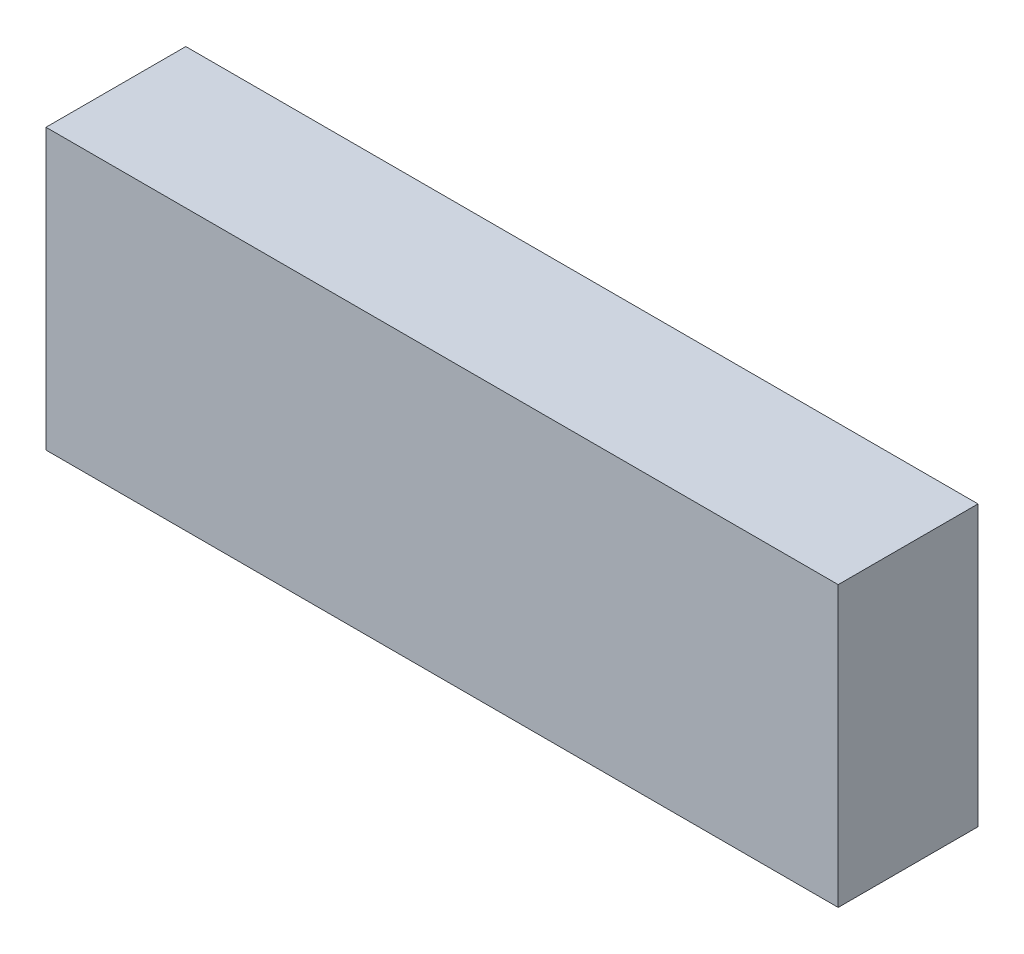
ISO-10303-21;
HEADER;
FILE_DESCRIPTION(('STEP AP214'),'2;1');
FILE_NAME('part.step','',(''),(''),'','','');
FILE_SCHEMA(('AUTOMOTIVE_DESIGN { 1 0 10303 214 1 1 1 1 }'));
ENDSEC;
DATA;
#1=APPLICATION_CONTEXT('core data for automotive mechanical design processes');
#2=APPLICATION_PROTOCOL_DEFINITION('international standard','automotive_design',2000,#1);
#3=PRODUCT_CONTEXT('',#1,'mechanical');
#4=PRODUCT('Part','Part','',(#3));
#5=PRODUCT_RELATED_PRODUCT_CATEGORY('part','',(#4));
#6=PRODUCT_DEFINITION_FORMATION('','',#4);
#7=PRODUCT_DEFINITION_CONTEXT('part definition',#1,'design');
#8=PRODUCT_DEFINITION('design','',#6,#7);
#9=PRODUCT_DEFINITION_SHAPE('','',#8);
#10=(LENGTH_UNIT() NAMED_UNIT(*) SI_UNIT(.MILLI.,.METRE.));
#11=(NAMED_UNIT(*) PLANE_ANGLE_UNIT() SI_UNIT($,.RADIAN.));
#12=(NAMED_UNIT(*) SI_UNIT($,.STERADIAN.) SOLID_ANGLE_UNIT());
#13=UNCERTAINTY_MEASURE_WITH_UNIT(LENGTH_MEASURE(1.E-05),#10,'distance_accuracy_value','');
#14=(GEOMETRIC_REPRESENTATION_CONTEXT(3) GLOBAL_UNCERTAINTY_ASSIGNED_CONTEXT((#13)) GLOBAL_UNIT_ASSIGNED_CONTEXT((#10,
#11,#12)) REPRESENTATION_CONTEXT('',''));
#15=CARTESIAN_POINT('',(0.,0.,0.));
#16=DIRECTION('',(0.,0.,1.));
#17=DIRECTION('',(1.,0.,0.));
#18=AXIS2_PLACEMENT_3D('',#15,#16,#17);
#19=CARTESIAN_POINT('',(52.9979544735839,-83.0177683615576,19.05));
#20=DIRECTION('',(1.,0.,0.));
#21=DIRECTION('',(0.,0.,-1.));
#22=AXIS2_PLACEMENT_3D('',#19,#20,#21);
#23=PLANE('',#22);
#24=DIRECTION('',(0.,-1.,0.));
#25=VECTOR('',#24,1.);
#26=CARTESIAN_POINT('',(52.9979544735839,-83.0177683615576,0.));
#27=LINE('',#26,#25);
#28=CARTESIAN_POINT('',(52.9979544735839,25.2152812507937,0.));
#29=VERTEX_POINT('',#28);
#30=CARTESIAN_POINT('',(52.9979544735839,-12.8847187492063,0.));
#31=VERTEX_POINT('',#30);
#32=EDGE_CURVE('E100',#29,#31,#27,.T.);
#33=ORIENTED_EDGE('',*,*,#32,.F.);
#34=DIRECTION('',(0.,0.,-1.));
#35=VECTOR('',#34,1.);
#36=CARTESIAN_POINT('',(52.9979544735839,25.2152812507937,19.05));
#37=LINE('',#36,#35);
#38=CARTESIAN_POINT('',(52.9979544735839,25.2152812507937,19.05));
#39=VERTEX_POINT('',#38);
#40=EDGE_CURVE('E11',#39,#29,#37,.T.);
#41=ORIENTED_EDGE('',*,*,#40,.F.);
#42=DIRECTION('',(0.,-1.,0.));
#43=VECTOR('',#42,1.);
#44=CARTESIAN_POINT('',(52.9979544735839,-83.0177683615576,19.05));
#45=LINE('',#44,#43);
#46=CARTESIAN_POINT('',(52.9979544735839,-12.8847187492063,19.05));
#47=VERTEX_POINT('',#46);
#48=EDGE_CURVE('E94',#39,#47,#45,.T.);
#49=ORIENTED_EDGE('',*,*,#48,.T.);
#50=DIRECTION('',(0.,0.,-1.));
#51=VECTOR('',#50,1.);
#52=CARTESIAN_POINT('',(52.9979544735839,-12.8847187492063,19.05));
#53=LINE('',#52,#51);
#54=EDGE_CURVE('E75',#47,#31,#53,.T.);
#55=ORIENTED_EDGE('',*,*,#54,.T.);
#56=EDGE_LOOP('',(#33,#41,#49,#55));
#57=FACE_BOUND('',#56,.T.);
#58=ADVANCED_FACE('F37',(#57),#23,.T.);
#59=CARTESIAN_POINT('',(-0.977045526416143,25.2152812507937,19.05));
#60=DIRECTION('',(0.,1.,0.));
#61=DIRECTION('',(0.,0.,1.));
#62=AXIS2_PLACEMENT_3D('',#59,#60,#61);
#63=PLANE('',#62);
#64=DIRECTION('',(1.,0.,0.));
#65=VECTOR('',#64,1.);
#66=CARTESIAN_POINT('',(-0.977045526416143,25.2152812507937,0.));
#67=LINE('',#66,#65);
#68=CARTESIAN_POINT('',(-54.9520455264161,25.2152812507937,0.));
#69=VERTEX_POINT('',#68);
#70=EDGE_CURVE('E88',#69,#29,#67,.T.);
#71=ORIENTED_EDGE('',*,*,#70,.F.);
#72=DIRECTION('',(0.,0.,-1.));
#73=VECTOR('',#72,1.);
#74=CARTESIAN_POINT('',(-54.9520455264161,25.2152812507937,19.05));
#75=LINE('',#74,#73);
#76=CARTESIAN_POINT('',(-54.9520455264161,25.2152812507937,19.05));
#77=VERTEX_POINT('',#76);
#78=EDGE_CURVE('E45',#77,#69,#75,.T.);
#79=ORIENTED_EDGE('',*,*,#78,.F.);
#80=DIRECTION('',(1.,0.,0.));
#81=VECTOR('',#80,1.);
#82=CARTESIAN_POINT('',(-0.977045526416143,25.2152812507937,19.05));
#83=LINE('',#82,#81);
#84=EDGE_CURVE('E86',#77,#39,#83,.T.);
#85=ORIENTED_EDGE('',*,*,#84,.T.);
#86=ORIENTED_EDGE('',*,*,#40,.T.);
#87=EDGE_LOOP('',(#71,#79,#85,#86));
#88=FACE_BOUND('',#87,.T.);
#89=ADVANCED_FACE('F84',(#88),#63,.T.);
#90=CARTESIAN_POINT('',(-54.9520455264161,-83.0177683615576,19.05));
#91=DIRECTION('',(1.,0.,0.));
#92=DIRECTION('',(0.,0.,-1.));
#93=AXIS2_PLACEMENT_3D('',#90,#91,#92);
#94=PLANE('',#93);
#95=DIRECTION('',(0.,-1.,0.));
#96=VECTOR('',#95,1.);
#97=CARTESIAN_POINT('',(-54.9520455264161,-83.0177683615576,0.));
#98=LINE('',#97,#96);
#99=CARTESIAN_POINT('',(-54.9520455264161,-12.8847187492063,0.));
#100=VERTEX_POINT('',#99);
#101=EDGE_CURVE('E68',#69,#100,#98,.T.);
#102=ORIENTED_EDGE('',*,*,#101,.T.);
#103=DIRECTION('',(0.,0.,-1.));
#104=VECTOR('',#103,1.);
#105=CARTESIAN_POINT('',(-54.9520455264161,-12.8847187492063,19.05));
#106=LINE('',#105,#104);
#107=CARTESIAN_POINT('',(-54.9520455264161,-12.8847187492063,19.05));
#108=VERTEX_POINT('',#107);
#109=EDGE_CURVE('E89',#108,#100,#106,.T.);
#110=ORIENTED_EDGE('',*,*,#109,.F.);
#111=DIRECTION('',(0.,-1.,0.));
#112=VECTOR('',#111,1.);
#113=CARTESIAN_POINT('',(-54.9520455264161,-83.0177683615576,19.05));
#114=LINE('',#113,#112);
#115=EDGE_CURVE('E90',#77,#108,#114,.T.);
#116=ORIENTED_EDGE('',*,*,#115,.F.);
#117=ORIENTED_EDGE('',*,*,#78,.T.);
#118=EDGE_LOOP('',(#102,#110,#116,#117));
#119=FACE_BOUND('',#118,.T.);
#120=ADVANCED_FACE('F91',(#119),#94,.F.);
#121=CARTESIAN_POINT('',(-0.977045526416143,-12.8847187492063,19.05));
#122=DIRECTION('',(0.,1.,0.));
#123=DIRECTION('',(0.,0.,1.));
#124=AXIS2_PLACEMENT_3D('',#121,#122,#123);
#125=PLANE('',#124);
#126=DIRECTION('',(1.,0.,0.));
#127=VECTOR('',#126,1.);
#128=CARTESIAN_POINT('',(-0.977045526416143,-12.8847187492063,0.));
#129=LINE('',#128,#127);
#130=EDGE_CURVE('E96',#100,#31,#129,.T.);
#131=ORIENTED_EDGE('',*,*,#130,.T.);
#132=ORIENTED_EDGE('',*,*,#54,.F.);
#133=DIRECTION('',(1.,0.,0.));
#134=VECTOR('',#133,1.);
#135=CARTESIAN_POINT('',(-0.977045526416143,-12.8847187492063,19.05));
#136=LINE('',#135,#134);
#137=EDGE_CURVE('E53',#108,#47,#136,.T.);
#138=ORIENTED_EDGE('',*,*,#137,.F.);
#139=ORIENTED_EDGE('',*,*,#109,.T.);
#140=EDGE_LOOP('',(#131,#132,#138,#139));
#141=FACE_BOUND('',#140,.T.);
#142=ADVANCED_FACE('F109',(#141),#125,.F.);
#143=CARTESIAN_POINT('',(-0.977045526416143,-83.0177683615576,19.05));
#144=DIRECTION('',(0.,0.,1.));
#145=DIRECTION('',(1.,0.,0.));
#146=AXIS2_PLACEMENT_3D('',#143,#144,#145);
#147=PLANE('',#146);
#148=ORIENTED_EDGE('',*,*,#48,.F.);
#149=ORIENTED_EDGE('',*,*,#84,.F.);
#150=ORIENTED_EDGE('',*,*,#115,.T.);
#151=ORIENTED_EDGE('',*,*,#137,.T.);
#152=EDGE_LOOP('',(#148,#149,#150,#151));
#153=FACE_BOUND('',#152,.T.);
#154=ADVANCED_FACE('F93',(#153),#147,.T.);
#155=CARTESIAN_POINT('',(-0.977045526416143,-83.0177683615576,0.));
#156=DIRECTION('',(0.,0.,1.));
#157=DIRECTION('',(1.,0.,0.));
#158=AXIS2_PLACEMENT_3D('',#155,#156,#157);
#159=PLANE('',#158);
#160=ORIENTED_EDGE('',*,*,#32,.T.);
#161=ORIENTED_EDGE('',*,*,#130,.F.);
#162=ORIENTED_EDGE('',*,*,#101,.F.);
#163=ORIENTED_EDGE('',*,*,#70,.T.);
#164=EDGE_LOOP('',(#160,#161,#162,#163));
#165=FACE_BOUND('',#164,.T.);
#166=ADVANCED_FACE('F111',(#165),#159,.F.);
#167=CLOSED_SHELL('',(#58,#89,#120,#142,#154,#166));
#168=MANIFOLD_SOLID_BREP('B2',#167);
#169=ADVANCED_BREP_SHAPE_REPRESENTATION('',(#18,#168),#14);
#170=SHAPE_DEFINITION_REPRESENTATION(#9,#169);
ENDSEC;
END-ISO-10303-21;
